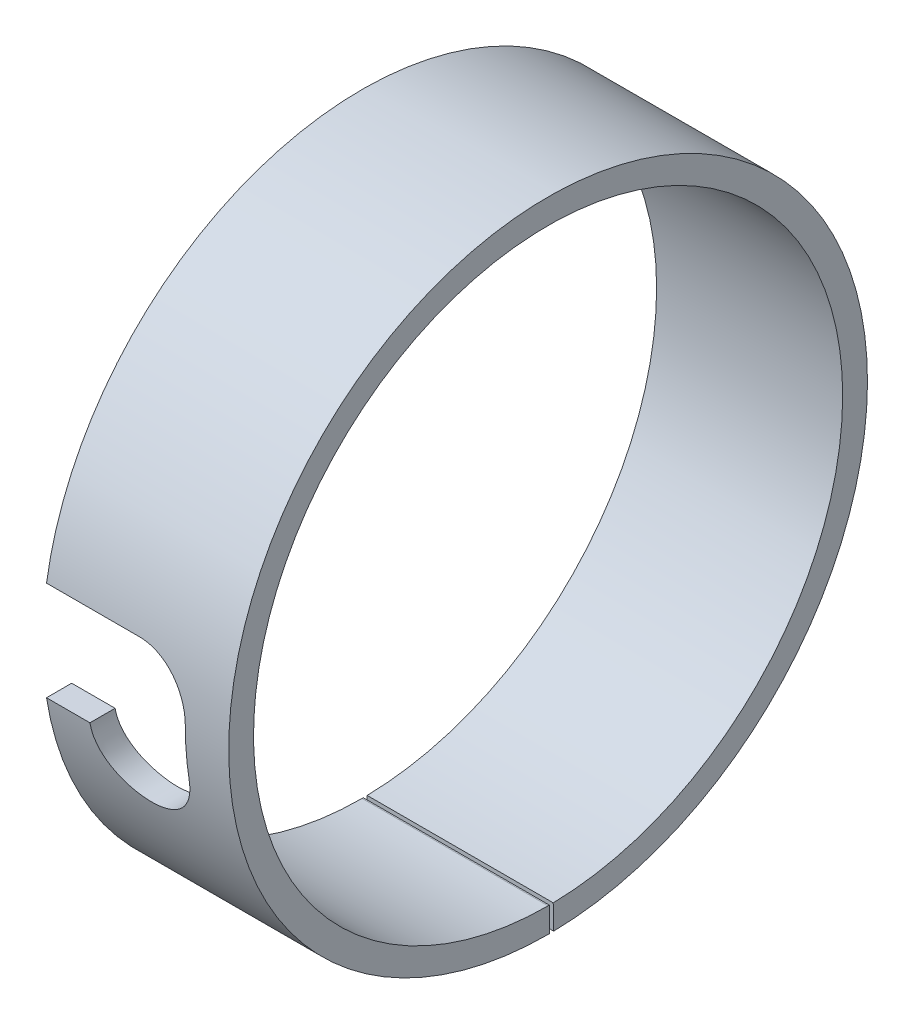
ISO-10303-21;
HEADER;
FILE_DESCRIPTION(('STEP AP214'),'2;1');
FILE_NAME('part.step','',(''),(''),'','','');
FILE_SCHEMA(('AUTOMOTIVE_DESIGN { 1 0 10303 214 1 1 1 1 }'));
ENDSEC;
DATA;
#1=APPLICATION_CONTEXT('core data for automotive mechanical design processes');
#2=APPLICATION_PROTOCOL_DEFINITION('international standard','automotive_design',2000,#1);
#3=PRODUCT_CONTEXT('',#1,'mechanical');
#4=PRODUCT('Part','Part','',(#3));
#5=PRODUCT_RELATED_PRODUCT_CATEGORY('part','',(#4));
#6=PRODUCT_DEFINITION_FORMATION('','',#4);
#7=PRODUCT_DEFINITION_CONTEXT('part definition',#1,'design');
#8=PRODUCT_DEFINITION('design','',#6,#7);
#9=PRODUCT_DEFINITION_SHAPE('','',#8);
#10=(LENGTH_UNIT() NAMED_UNIT(*) SI_UNIT(.MILLI.,.METRE.));
#11=(NAMED_UNIT(*) PLANE_ANGLE_UNIT() SI_UNIT($,.RADIAN.));
#12=(NAMED_UNIT(*) SI_UNIT($,.STERADIAN.) SOLID_ANGLE_UNIT());
#13=UNCERTAINTY_MEASURE_WITH_UNIT(LENGTH_MEASURE(1.E-05),#10,'distance_accuracy_value','');
#14=(GEOMETRIC_REPRESENTATION_CONTEXT(3) GLOBAL_UNCERTAINTY_ASSIGNED_CONTEXT((#13)) GLOBAL_UNIT_ASSIGNED_CONTEXT((#10,
#11,#12)) REPRESENTATION_CONTEXT('',''));
#15=CARTESIAN_POINT('',(0.,0.,0.));
#16=DIRECTION('',(0.,0.,1.));
#17=DIRECTION('',(1.,0.,0.));
#18=AXIS2_PLACEMENT_3D('',#15,#16,#17);
#19=CARTESIAN_POINT('',(338.,115.75,-118.100000000001));
#20=DIRECTION('',(1.,0.,0.));
#21=DIRECTION('',(0.,0.,1.));
#22=AXIS2_PLACEMENT_3D('',#19,#20,#21);
#23=PLANE('',#22);
#24=CARTESIAN_POINT('',(338.,139.5,-118.000000000001));
#25=DIRECTION('',(1.,0.,0.));
#26=DIRECTION('',(0.,0.,-1.));
#27=AXIS2_PLACEMENT_3D('',#24,#25,#26);
#28=CIRCLE('',#27,23.7500000000003);
#29=CARTESIAN_POINT('',(338.,143.5,-94.5892652827819));
#30=VERTEX_POINT('',#29);
#31=CARTESIAN_POINT('',(338.,115.753617240036,-118.414494652886));
#32=VERTEX_POINT('',#31);
#33=EDGE_CURVE('E248',#30,#32,#28,.F.);
#34=ORIENTED_EDGE('',*,*,#33,.F.);
#35=DIRECTION('',(0.,0.,1.));
#36=VECTOR('',#35,1.);
#37=CARTESIAN_POINT('',(338.,143.5,-92.5625767814434));
#38=LINE('',#37,#36);
#39=CARTESIAN_POINT('',(338.,143.5,-92.5625767814434));
#40=VERTEX_POINT('',#39);
#41=EDGE_CURVE('E276',#30,#40,#38,.T.);
#42=ORIENTED_EDGE('',*,*,#41,.T.);
#43=CARTESIAN_POINT('',(338.,139.5,-118.000000000001));
#44=DIRECTION('',(1.,0.,0.));
#45=DIRECTION('',(0.,0.,-1.));
#46=AXIS2_PLACEMENT_3D('',#43,#44,#45);
#47=CIRCLE('',#46,25.7500000000003);
#48=CARTESIAN_POINT('',(338.,113.753921849723,-118.449399465761));
#49=VERTEX_POINT('',#48);
#50=EDGE_CURVE('E267',#40,#49,#47,.F.);
#51=ORIENTED_EDGE('',*,*,#50,.T.);
#52=DIRECTION('',(0.,-0.999847695156391,-0.0174524064372694));
#53=VECTOR('',#52,1.);
#54=CARTESIAN_POINT('',(338.,115.753617240036,-118.414494652886));
#55=LINE('',#54,#53);
#56=EDGE_CURVE('E259',#32,#49,#55,.T.);
#57=ORIENTED_EDGE('',*,*,#56,.F.);
#58=EDGE_LOOP('',(#34,#42,#51,#57));
#59=FACE_BOUND('',#58,.T.);
#60=ADVANCED_FACE('F135',(#59),#23,.F.);
#61=CARTESIAN_POINT('',(353.,139.5,-118.000000000001));
#62=DIRECTION('',(1.,0.,0.));
#63=DIRECTION('',(0.,-0.999847695156391,-0.0174524064372693));
#64=AXIS2_PLACEMENT_3D('',#61,#62,#63);
#65=CYLINDRICAL_SURFACE('',#64,25.7500000000003);
#66=ORIENTED_EDGE('',*,*,#50,.F.);
#67=DIRECTION('',(1.,0.,0.));
#68=VECTOR('',#67,1.);
#69=CARTESIAN_POINT('',(353.,143.5,-92.5625767814435));
#70=LINE('',#69,#68);
#71=CARTESIAN_POINT('',(345.5,143.5,-92.5625767814434));
#72=VERTEX_POINT('',#71);
#73=EDGE_CURVE('E352',#40,#72,#70,.T.);
#74=ORIENTED_EDGE('',*,*,#73,.T.);
#75=CARTESIAN_POINT('',(349.5,139.5,-92.2500000000009));
#76=CARTESIAN_POINT('',(349.50000843318,139.612090964509,-92.2499929383089));
#77=CARTESIAN_POINT('',(349.495123614999,139.724159649726,-92.2507317666365));
#78=CARTESIAN_POINT('',(349.475816012682,139.947419112259,-92.2536472347804));
#79=CARTESIAN_POINT('',(349.461396355016,140.05861016526,-92.2558234032933));
#80=CARTESIAN_POINT('',(349.423267146034,140.279356384156,-92.2615596710617));
#81=CARTESIAN_POINT('',(349.399557522904,140.388911537399,-92.2651197810154));
#82=CARTESIAN_POINT('',(349.343163749521,140.605600937854,-92.2735168480953));
#83=CARTESIAN_POINT('',(349.310478932953,140.712735004686,-92.2783539000202));
#84=CARTESIAN_POINT('',(349.199437081499,141.029258864979,-92.2945876025436));
#85=CARTESIAN_POINT('',(349.108014875114,141.234213811648,-92.307719101874));
#86=CARTESIAN_POINT('',(348.946919286892,141.527852328029,-92.329782416334));
#87=CARTESIAN_POINT('',(348.889213135825,141.623450549481,-92.337532981689));
#88=CARTESIAN_POINT('',(348.766057912286,141.809522436376,-92.3536105653781));
#89=CARTESIAN_POINT('',(348.700608871648,141.899996122886,-92.3619375813422));
#90=CARTESIAN_POINT('',(348.561056708755,142.076691636837,-92.3790867956007));
#91=CARTESIAN_POINT('',(348.486816387624,142.162804450899,-92.3879152897462));
#92=CARTESIAN_POINT('',(348.331041746762,142.328152286018,-92.4056457193129));
#93=CARTESIAN_POINT('',(348.249507624872,142.407387493514,-92.4145476527362));
#94=CARTESIAN_POINT('',(348.079764543955,142.55845418226,-92.4321657167246));
#95=CARTESIAN_POINT('',(347.991552737686,142.630282474152,-92.4408817659789));
#96=CARTESIAN_POINT('',(347.809310770075,142.766142640191,-92.4578878597921));
#97=CARTESIAN_POINT('',(347.715280324091,142.83017413247,-92.4661778834739));
#98=CARTESIAN_POINT('',(347.430486876596,143.006982949165,-92.4896586150217));
#99=CARTESIAN_POINT('',(347.23247684361,143.108470615313,-92.5039463123691));
#100=CARTESIAN_POINT('',(346.822631507868,143.278037414842,-92.528519912969));
#101=CARTESIAN_POINT('',(346.610808224275,143.346145164577,-92.5388092424193));
#102=CARTESIAN_POINT('',(346.248248446264,143.430546639514,-92.5517287783254));
#103=CARTESIAN_POINT('',(346.09975036004,143.456457013478,-92.5557576317402));
#104=CARTESIAN_POINT('',(345.800870785894,143.491183439385,-92.5611900656631));
#105=CARTESIAN_POINT('',(345.650491183816,143.500015412753,-92.5625960912726));
#106=CARTESIAN_POINT('',(345.5,143.5,-92.5625767814434));
#107=B_SPLINE_CURVE_WITH_KNOTS('',3,(#75,#76,#77,#78,#79,#80,#81,#82,#83,#84,#85,#86,#87,#88,
#89,#90,#91,#92,#93,#94,#95,#96,#97,#98,#99,#100,#101,#102,#103,#104,#105,#106),.UNSPECIFIED.,
.F.,.F.,(4,2,2,2,2,2,2,2,2,2,2,2,2,2,2,4),(0.,0.336129086672246,0.672148011402556,
1.00816953373031,1.34421600892141,2.01497336537978,2.35048597866614,2.68599721260628,
3.02768841925539,3.36937036042151,3.71119881806484,4.05304401093263,4.71874825553939,
5.38388079421972,5.83532136930664,6.28634088332569),.UNSPECIFIED.);
#108=CARTESIAN_POINT('',(349.5,139.5,-92.2500000000009));
#109=VERTEX_POINT('',#108);
#110=EDGE_CURVE('E291',#109,#72,#107,.T.);
#111=ORIENTED_EDGE('',*,*,#110,.F.);
#112=CARTESIAN_POINT('',(349.5,139.5,-118.000000000001));
#113=DIRECTION('',(-1.,0.,0.));
#114=DIRECTION('',(0.,0.,1.));
#115=AXIS2_PLACEMENT_3D('',#112,#113,#114);
#116=CIRCLE('',#115,25.7500000000003);
#117=CARTESIAN_POINT('',(349.5,135.500000000002,-92.5625767814434));
#118=VERTEX_POINT('',#117);
#119=EDGE_CURVE('E330',#109,#118,#116,.F.);
#120=ORIENTED_EDGE('',*,*,#119,.T.);
#121=CARTESIAN_POINT('',(341.5,135.500000000002,-92.5625767814433));
#122=CARTESIAN_POINT('',(341.499989349324,135.385418830857,-92.5805867680038));
#123=CARTESIAN_POINT('',(341.505024544503,135.270981812715,-92.5993826966726));
#124=CARTESIAN_POINT('',(341.524937106057,135.043240495889,-92.6383550806432));
#125=CARTESIAN_POINT('',(341.539811260553,134.9299358398,-92.6585310835002));
#126=CARTESIAN_POINT('',(341.579156049342,134.705207770023,-92.7000879637713));
#127=CARTESIAN_POINT('',(341.603628397337,134.593784695987,-92.721469055763));
#128=CARTESIAN_POINT('',(341.66185808202,134.373606763667,-92.7651983885698));
#129=CARTESIAN_POINT('',(341.695616132293,134.264852111144,-92.7875467036025));
#130=CARTESIAN_POINT('',(341.810259286541,133.943940978857,-92.8556108894628));
#131=CARTESIAN_POINT('',(341.904596122855,133.736672993355,-92.9024327605243));
#132=CARTESIAN_POINT('',(342.126601441529,133.340989116697,-92.9965906103569));
#133=CARTESIAN_POINT('',(342.254253937869,133.15256424377,-93.0439263321522));
#134=CARTESIAN_POINT('',(342.433444868841,132.931474228191,-93.1018242911723));
#135=CARTESIAN_POINT('',(342.470878839218,132.887303813108,-93.1135223618175));
#136=CARTESIAN_POINT('',(342.547682027814,132.800623134722,-93.136716723612));
#137=CARTESIAN_POINT('',(342.587050911548,132.758112586745,-93.1482130491736));
#138=CARTESIAN_POINT('',(342.667688377252,132.674861960583,-93.170947380757));
#139=CARTESIAN_POINT('',(342.708956940758,132.634121865195,-93.1821853892881));
#140=CARTESIAN_POINT('',(342.793372514092,132.554545987144,-93.204337567565));
#141=CARTESIAN_POINT('',(342.836519616797,132.515710298839,-93.2152517212541));
#142=CARTESIAN_POINT('',(342.968619710511,132.402078346591,-93.2474605703877));
#143=CARTESIAN_POINT('',(343.060221290092,132.330167699868,-93.2682187708484));
#144=CARTESIAN_POINT('',(343.24957483431,132.194475808364,-93.3079605103145));
#145=CARTESIAN_POINT('',(343.347327461777,132.13069544194,-93.326943857514));
#146=CARTESIAN_POINT('',(343.640053846172,131.957147182171,-93.3792347147331));
#147=CARTESIAN_POINT('',(343.842310765132,131.85855469123,-93.40979721434));
#148=CARTESIAN_POINT('',(344.261204066725,131.695166419348,-93.4611638330028));
#149=CARTESIAN_POINT('',(344.477834868695,131.630357607442,-93.4819717142762));
#150=CARTESIAN_POINT('',(344.809424780097,131.560803199007,-93.5044454307098));
#151=CARTESIAN_POINT('',(344.921325050193,131.542217635298,-93.5104840365788));
#152=CARTESIAN_POINT('',(345.146457522848,131.514764473587,-93.5194212063009));
#153=CARTESIAN_POINT('',(345.259689530595,131.505895471636,-93.5223202237936));
#154=CARTESIAN_POINT('',(345.486466655973,131.498345983854,-93.5247870262985));
#155=CARTESIAN_POINT('',(345.600011552986,131.499659570521,-93.5243567493639));
#156=CARTESIAN_POINT('',(345.826462137857,131.512263160664,-93.5202412477809));
#157=CARTESIAN_POINT('',(345.939367780026,131.523553868391,-93.5165557933606));
#158=CARTESIAN_POINT('',(346.25742730072,131.569192472579,-93.5017173069437));
#159=CARTESIAN_POINT('',(346.460873364656,131.614921588264,-93.486898241681));
#160=CARTESIAN_POINT('',(346.857791068629,131.736389778658,-93.4481596512553));
#161=CARTESIAN_POINT('',(347.051254268972,131.812153790411,-93.4242325646425));
#162=CARTESIAN_POINT('',(347.336449728714,131.94931831106,-93.381873184642));
#163=CARTESIAN_POINT('',(347.433445412554,132.000865644047,-93.3661043033845));
#164=CARTESIAN_POINT('',(347.622748200917,132.111478569181,-93.3327019466033));
#165=CARTESIAN_POINT('',(347.715055161583,132.170544391813,-93.3150684139204));
#166=CARTESIAN_POINT('',(347.894254447308,132.295821715296,-93.2782165984358));
#167=CARTESIAN_POINT('',(347.981150026887,132.362028854444,-93.2589992846341));
#168=CARTESIAN_POINT('',(348.148941124212,132.501315555911,-93.2192381381545));
#169=CARTESIAN_POINT('',(348.229836991938,132.574394716801,-93.1986943829826));
#170=CARTESIAN_POINT('',(348.346997950375,132.689684103206,-93.1668823683509));
#171=CARTESIAN_POINT('',(348.385740043884,132.729510300882,-93.1559919470338));
#172=CARTESIAN_POINT('',(348.461505723274,132.81071083808,-93.1340055080686));
#173=CARTESIAN_POINT('',(348.498529275696,132.852085207716,-93.1229094864235));
#174=CARTESIAN_POINT('',(348.606923048394,132.978447852651,-93.089370832917));
#175=CARTESIAN_POINT('',(348.675624839602,133.065683998792,-93.0666753026408));
#176=CARTESIAN_POINT('',(348.805565788455,133.245591855704,-93.0209386636847));
#177=CARTESIAN_POINT('',(348.866796821901,133.338269324391,-92.9978972088593));
#178=CARTESIAN_POINT('',(348.9813640793,133.528374887103,-92.9518113103614));
#179=CARTESIAN_POINT('',(349.034700845997,133.625802653924,-92.9287668670036));
#180=CARTESIAN_POINT('',(349.134631626769,133.827772239156,-92.88228936556));
#181=CARTESIAN_POINT('',(349.180976043196,133.932439705858,-92.8588653203312));
#182=CARTESIAN_POINT('',(349.264614765792,134.145462848812,-92.8126359200713));
#183=CARTESIAN_POINT('',(349.301909143241,134.253818496007,-92.7898305601687));
#184=CARTESIAN_POINT('',(349.367085050059,134.473305477955,-92.7451516731826));
#185=CARTESIAN_POINT('',(349.394982297853,134.584431840315,-92.723276644056));
#186=CARTESIAN_POINT('',(349.441164994672,134.808830870327,-92.6806701634131));
#187=CARTESIAN_POINT('',(349.459455395372,134.922102401035,-92.6599381277036));
#188=CARTESIAN_POINT('',(349.481868290306,135.112971572838,-92.6263407310124));
#189=CARTESIAN_POINT('',(349.488663330698,135.190200584873,-92.6131082763543));
#190=CARTESIAN_POINT('',(349.497727184715,135.344931222599,-92.5873247328951));
#191=CARTESIAN_POINT('',(349.500001980708,135.422432351803,-92.5747727649388));
#192=CARTESIAN_POINT('',(349.5,135.500000000002,-92.5625767814434));
#193=B_SPLINE_CURVE_WITH_KNOTS('',3,(#121,#122,#123,#124,#125,#126,#127,#128,#129,#130,#131,
#132,#133,#134,#135,#136,#137,#138,#139,#140,#141,#142,#143,#144,#145,#146,#147,#148,#149,#150,
#151,#152,#153,#154,#155,#156,#157,#158,#159,#160,#161,#162,#163,#164,#165,#166,#167,#168,#169,
#170,#171,#172,#173,#174,#175,#176,#177,#178,#179,#180,#181,#182,#183,#184,#185,#186,#187,#188,
#189,#190,#191,#192),.UNSPECIFIED.,.F.,.F.,(4,2,2,2,2,2,2,2,2,2,2,2,2,2,2,2,2,2,2,2,2,2,2,2,2,2,
2,2,2,2,2,2,2,2,2,4),(0.,0.347820551141876,0.695527613982409,1.04329678616594,1.39109269107721,
2.08526370306509,2.77910223792432,2.95627981976707,3.13342688024223,3.31057221916131,
3.48772632637407,3.84207914527631,4.19647021442037,4.87440362516376,5.55207535109248,
5.89246840163617,6.23281226218603,6.57295801623801,6.91312778194602,7.53739035366799,
8.16217232047281,8.49476458243583,8.82736704269044,9.1597674973644,9.4921485468965,
9.66196109035049,9.8317769385229,10.1713724598702,10.5113340492656,10.8512722548767,
11.2013850753352,11.5514951381548,11.9010166353427,12.2503578007926,12.4861783899086,
12.7216866712415),.UNSPECIFIED.);
#194=CARTESIAN_POINT('',(341.5,135.500000000002,-92.5625767814433));
#195=VERTEX_POINT('',#194);
#196=EDGE_CURVE('E282',#195,#118,#193,.T.);
#197=ORIENTED_EDGE('',*,*,#196,.F.);
#198=DIRECTION('',(1.,0.,0.));
#199=VECTOR('',#198,1.);
#200=CARTESIAN_POINT('',(353.,135.500000000002,-92.5625767814434));
#201=LINE('',#200,#199);
#202=CARTESIAN_POINT('',(338.,135.500000000002,-92.5625767814433));
#203=VERTEX_POINT('',#202);
#204=EDGE_CURVE('E258',#203,#195,#201,.T.);
#205=ORIENTED_EDGE('',*,*,#204,.F.);
#206=CARTESIAN_POINT('',(338.,113.75,-118.000000000001));
#207=VERTEX_POINT('',#206);
#208=EDGE_CURVE('E182',#207,#203,#47,.F.);
#209=ORIENTED_EDGE('',*,*,#208,.F.);
#210=DIRECTION('',(1.,0.,0.));
#211=VECTOR('',#210,1.);
#212=CARTESIAN_POINT('',(0.,113.75,-118.000000000001));
#213=LINE('',#212,#211);
#214=CARTESIAN_POINT('',(353.,113.75,-118.000000000001));
#215=VERTEX_POINT('',#214);
#216=EDGE_CURVE('E218',#207,#215,#213,.T.);
#217=ORIENTED_EDGE('',*,*,#216,.T.);
#218=CARTESIAN_POINT('',(353.,139.5,-118.000000000001));
#219=DIRECTION('',(1.,0.,0.));
#220=DIRECTION('',(0.,0.,-1.));
#221=AXIS2_PLACEMENT_3D('',#218,#219,#220);
#222=CIRCLE('',#221,25.7500000000003);
#223=CARTESIAN_POINT('',(353.,113.753921849723,-118.449399465761));
#224=VERTEX_POINT('',#223);
#225=EDGE_CURVE('E251',#224,#215,#222,.T.);
#226=ORIENTED_EDGE('',*,*,#225,.F.);
#227=DIRECTION('',(1.,0.,0.));
#228=VECTOR('',#227,1.);
#229=CARTESIAN_POINT('',(353.,113.753921849723,-118.449399465761));
#230=LINE('',#229,#228);
#231=EDGE_CURVE('E247',#49,#224,#230,.T.);
#232=ORIENTED_EDGE('',*,*,#231,.F.);
#233=EDGE_LOOP('',(#66,#74,#111,#120,#197,#205,#209,#217,#226,#232));
#234=FACE_BOUND('',#233,.T.);
#235=ADVANCED_FACE('F266',(#234),#65,.T.);
#236=CARTESIAN_POINT('',(353.,139.5,-118.000000000001));
#237=DIRECTION('',(1.,0.,0.));
#238=DIRECTION('',(0.,-0.999847695156391,-0.0174524064372693));
#239=AXIS2_PLACEMENT_3D('',#236,#237,#238);
#240=CYLINDRICAL_SURFACE('',#239,23.7500000000003);
#241=DIRECTION('',(1.,0.,0.));
#242=VECTOR('',#241,1.);
#243=CARTESIAN_POINT('',(353.,143.5,-94.5892652827819));
#244=LINE('',#243,#242);
#245=CARTESIAN_POINT('',(345.5,143.5,-94.5892652827818));
#246=VERTEX_POINT('',#245);
#247=EDGE_CURVE('E364',#246,#30,#244,.F.);
#248=ORIENTED_EDGE('',*,*,#247,.T.);
#249=ORIENTED_EDGE('',*,*,#33,.T.);
#250=DIRECTION('',(1.,0.,0.));
#251=VECTOR('',#250,1.);
#252=CARTESIAN_POINT('',(353.,115.753617240036,-118.414494652886));
#253=LINE('',#252,#251);
#254=CARTESIAN_POINT('',(353.,115.753617240036,-118.414494652886));
#255=VERTEX_POINT('',#254);
#256=EDGE_CURVE('E256',#32,#255,#253,.T.);
#257=ORIENTED_EDGE('',*,*,#256,.T.);
#258=CARTESIAN_POINT('',(353.,139.5,-118.000000000001));
#259=DIRECTION('',(1.,0.,0.));
#260=DIRECTION('',(0.,0.,-1.));
#261=AXIS2_PLACEMENT_3D('',#258,#259,#260);
#262=CIRCLE('',#261,23.7500000000003);
#263=CARTESIAN_POINT('',(353.,115.75,-118.000000000001));
#264=VERTEX_POINT('',#263);
#265=EDGE_CURVE('E159',#255,#264,#262,.T.);
#266=ORIENTED_EDGE('',*,*,#265,.T.);
#267=DIRECTION('',(1.,0.,0.));
#268=VECTOR('',#267,1.);
#269=CARTESIAN_POINT('',(353.,115.75,-118.000000000001));
#270=LINE('',#269,#268);
#271=CARTESIAN_POINT('',(338.,115.75,-118.000000000001));
#272=VERTEX_POINT('',#271);
#273=EDGE_CURVE('E211',#272,#264,#270,.T.);
#274=ORIENTED_EDGE('',*,*,#273,.F.);
#275=CARTESIAN_POINT('',(338.,135.500000000002,-94.5892652827817));
#276=VERTEX_POINT('',#275);
#277=EDGE_CURVE('E242',#272,#276,#28,.F.);
#278=ORIENTED_EDGE('',*,*,#277,.T.);
#279=DIRECTION('',(1.,0.,0.));
#280=VECTOR('',#279,1.);
#281=CARTESIAN_POINT('',(353.,135.500000000002,-94.5892652827817));
#282=LINE('',#281,#280);
#283=CARTESIAN_POINT('',(341.5,135.500000000002,-94.5892652827817));
#284=VERTEX_POINT('',#283);
#285=EDGE_CURVE('E326',#284,#276,#282,.F.);
#286=ORIENTED_EDGE('',*,*,#285,.F.);
#287=CARTESIAN_POINT('',(349.5,135.500000000002,-94.5892652827817));
#288=CARTESIAN_POINT('',(349.500013336012,135.385187098226,-94.6088737117858));
#289=CARTESIAN_POINT('',(349.495021246226,135.270533641799,-94.6293412538894));
#290=CARTESIAN_POINT('',(349.475227050707,135.042388441157,-94.6717864115223));
#291=CARTESIAN_POINT('',(349.46042755002,134.928896396575,-94.6937636246635));
#292=CARTESIAN_POINT('',(349.421226987398,134.703899911419,-94.7390215673879));
#293=CARTESIAN_POINT('',(349.396829759356,134.592394695758,-94.7623017732987));
#294=CARTESIAN_POINT('',(349.338700279596,134.372072474041,-94.8099254951435));
#295=CARTESIAN_POINT('',(349.304967488674,134.263255623655,-94.8342690724276));
#296=CARTESIAN_POINT('',(349.228494878537,134.049117739778,-94.8837189047676));
#297=CARTESIAN_POINT('',(349.185762245902,133.943793994173,-94.9088245376957));
#298=CARTESIAN_POINT('',(349.09159257738,133.737230128266,-94.9595075422812));
#299=CARTESIAN_POINT('',(349.040155540667,133.635990008352,-94.9850849139835));
#300=CARTESIAN_POINT('',(348.928917565941,133.438254413589,-95.0363727657973));
#301=CARTESIAN_POINT('',(348.869116658375,133.341758921471,-95.0620832454239));
#302=CARTESIAN_POINT('',(348.741524762248,133.154180841795,-95.1132675185943));
#303=CARTESIAN_POINT('',(348.673737318452,133.063095879614,-95.1387414117694));
#304=CARTESIAN_POINT('',(348.56567594149,132.930155330795,-95.1767262603417));
#305=CARTESIAN_POINT('',(348.528207516924,132.886058540704,-95.1894692688494));
#306=CARTESIAN_POINT('',(348.451356925623,132.799510720241,-95.2147421745726));
#307=CARTESIAN_POINT('',(348.411975082113,132.75705941407,-95.2272721073024));
#308=CARTESIAN_POINT('',(348.331336423281,132.673893041476,-95.2520628191266));
#309=CARTESIAN_POINT('',(348.290079629034,132.633177955548,-95.2643236012438));
#310=CARTESIAN_POINT('',(348.205697098185,132.553628463976,-95.2885017548632));
#311=CARTESIAN_POINT('',(348.162571278648,132.51479414195,-95.3004191110874));
#312=CARTESIAN_POINT('',(348.030543153292,132.401146663908,-95.3355990576744));
#313=CARTESIAN_POINT('',(347.938992022601,132.329190893063,-95.3582889576059));
#314=CARTESIAN_POINT('',(347.749685151136,132.193382125461,-95.401749636561));
#315=CARTESIAN_POINT('',(347.651928841288,132.12952987349,-95.4225202391361));
#316=CARTESIAN_POINT('',(347.357709389097,131.954987873959,-95.4800096269378));
#317=CARTESIAN_POINT('',(347.153700771107,131.855707312386,-95.5136770128143));
#318=CARTESIAN_POINT('',(346.730809014985,131.691679827443,-95.5701036925072));
#319=CARTESIAN_POINT('',(346.51193125982,131.626920480928,-95.5928669101059));
#320=CARTESIAN_POINT('',(346.178862698238,131.558426253055,-95.6170953713338));
#321=CARTESIAN_POINT('',(346.067812315799,131.540396496515,-95.6235081162803));
#322=CARTESIAN_POINT('',(345.844395606292,131.513888422641,-95.6329541317375));
#323=CARTESIAN_POINT('',(345.732029468062,131.505408751242,-95.6359878813413));
#324=CARTESIAN_POINT('',(345.563293521353,131.500116399833,-95.6378811540909));
#325=CARTESIAN_POINT('',(345.507029073427,131.499589464649,-95.6380695954248));
#326=CARTESIAN_POINT('',(345.394536856665,131.50104560618,-95.6375486663624));
#327=CARTESIAN_POINT('',(345.33830908748,131.503028658615,-95.6368393046511));
#328=CARTESIAN_POINT('',(345.169868055424,131.512674252789,-95.6333913262445));
#329=CARTESIAN_POINT('',(345.057870909902,131.524032436927,-95.6293330993708));
#330=CARTESIAN_POINT('',(344.844649794302,131.554870592499,-95.6183633395152));
#331=CARTESIAN_POINT('',(344.743301110352,131.573600891951,-95.611715642505));
#332=CARTESIAN_POINT('',(344.542546421449,131.618677091193,-95.5958081517458));
#333=CARTESIAN_POINT('',(344.443140281893,131.6450224613,-95.586548539675));
#334=CARTESIAN_POINT('',(344.148511962105,131.735053574353,-95.5551294976757));
#335=CARTESIAN_POINT('',(343.956934342886,131.809726199876,-95.5293328344496));
#336=CARTESIAN_POINT('',(343.574933829989,131.992182668008,-95.4676887859987));
#337=CARTESIAN_POINT('',(343.385535712737,132.101922615786,-95.4312630558911));
#338=CARTESIAN_POINT('',(343.117532796041,132.287594310846,-95.3715242015742));
#339=CARTESIAN_POINT('',(343.030879583317,132.352996411487,-95.3507608262126));
#340=CARTESIAN_POINT('',(342.863485942386,132.490604096778,-95.3077972752875));
#341=CARTESIAN_POINT('',(342.782744950755,132.562809031628,-95.2855972370162));
#342=CARTESIAN_POINT('',(342.665570462196,132.677011813478,-95.2511325418437));
#343=CARTESIAN_POINT('',(342.626672198329,132.716638155918,-95.2392821602943));
#344=CARTESIAN_POINT('',(342.550619416586,132.797463778531,-95.215349761639));
#345=CARTESIAN_POINT('',(342.513464923117,132.838663080705,-95.2032677412943));
#346=CARTESIAN_POINT('',(342.404691032606,132.964517254633,-95.1667437343699));
#347=CARTESIAN_POINT('',(342.335755480793,133.051434008447,-95.1420221000264));
#348=CARTESIAN_POINT('',(342.205309738677,133.230744177193,-95.0921936470248));
#349=CARTESIAN_POINT('',(342.143809490888,133.323144684306,-95.0670863621187));
#350=CARTESIAN_POINT('',(342.028653825779,133.512656170822,-95.0168787572585));
#351=CARTESIAN_POINT('',(341.974997834013,133.609766804602,-94.9917784369288));
#352=CARTESIAN_POINT('',(341.823181850487,133.913453835005,-94.9154345337302));
#353=CARTESIAN_POINT('',(341.738108318421,134.126988259834,-94.8646711909901));
#354=CARTESIAN_POINT('',(341.638533802495,134.455821586441,-94.7915642017045));
#355=CARTESIAN_POINT('',(341.610022166674,134.566797199155,-94.7677126771547));
#356=CARTESIAN_POINT('',(341.562562854175,134.791021457289,-94.7212312287169));
#357=CARTESIAN_POINT('',(341.54361023402,134.904268896252,-94.6986006788169));
#358=CARTESIAN_POINT('',(341.519770175451,135.098048687134,-94.6613638077947));
#359=CARTESIAN_POINT('',(341.512369553255,135.178211580719,-94.6463856617585));
#360=CARTESIAN_POINT('',(341.502486655774,135.338887713435,-94.6172217133803));
#361=CARTESIAN_POINT('',(341.49999876369,135.419400446868,-94.6030350242155));
#362=CARTESIAN_POINT('',(341.5,135.500000000002,-94.5892652827817));
#363=B_SPLINE_CURVE_WITH_KNOTS('',3,(#287,#288,#289,#290,#291,#292,#293,#294,#295,#296,#297,
#298,#299,#300,#301,#302,#303,#304,#305,#306,#307,#308,#309,#310,#311,#312,#313,#314,#315,#316,
#317,#318,#319,#320,#321,#322,#323,#324,#325,#326,#327,#328,#329,#330,#331,#332,#333,#334,#335,
#336,#337,#338,#339,#340,#341,#342,#343,#344,#345,#346,#347,#348,#349,#350,#351,#352,#353,#354,
#355,#356,#357,#358,#359,#360,#361,#362),.UNSPECIFIED.,.F.,.F.,(4,2,2,2,2,2,2,2,2,2,2,2,2,2,2,2,
2,2,2,2,2,2,2,2,2,2,2,2,2,2,2,2,2,2,2,2,2,4),(0.,0.349297309506514,0.698501875808643,
1.04756709084596,1.39665247149052,1.74546014925733,2.09426786012987,2.44307430127162,
2.79172650638472,2.96943738124797,3.14711833994124,3.32479730202566,3.50248415635322,
3.85786595047493,4.2132803837743,4.89795252011503,5.58237809696232,5.92006627639752,
6.25770657039145,6.42645492566148,6.59520164854542,6.93261689108039,7.24211715543251,
7.55159589703966,8.17071694232995,8.83329173246909,9.16458994842199,9.49585655105535,
9.66614720577326,9.83644024322732,10.1770017622111,10.5180137590814,10.8590007706164,
11.561300169125,11.9121002900441,12.2627188070311,12.5082342786027,12.7534688856803),.UNSPECIFIED.);
#364=CARTESIAN_POINT('',(349.5,135.500000000002,-94.5892652827817));
#365=VERTEX_POINT('',#364);
#366=EDGE_CURVE('E373',#365,#284,#363,.T.);
#367=ORIENTED_EDGE('',*,*,#366,.F.);
#368=CARTESIAN_POINT('',(349.5,139.5,-118.000000000001));
#369=DIRECTION('',(1.,0.,0.));
#370=DIRECTION('',(0.,0.,-1.));
#371=AXIS2_PLACEMENT_3D('',#368,#369,#370);
#372=CIRCLE('',#371,23.7500000000003);
#373=CARTESIAN_POINT('',(349.5,139.5,-94.2500000000009));
#374=VERTEX_POINT('',#373);
#375=EDGE_CURVE('E367',#365,#374,#372,.F.);
#376=ORIENTED_EDGE('',*,*,#375,.T.);
#377=CARTESIAN_POINT('',(345.5,143.5,-94.5892652827818));
#378=CARTESIAN_POINT('',(345.611985379615,143.500008003411,-94.5892728251598));
#379=CARTESIAN_POINT('',(345.7239464207,143.495117936625,-94.588431216665));
#380=CARTESIAN_POINT('',(345.946981608024,143.475805679652,-94.5851405973787));
#381=CARTESIAN_POINT('',(346.058056060766,143.461386942125,-94.5826921688118));
#382=CARTESIAN_POINT('',(346.278556765236,143.423281913114,-94.5762788390222));
#383=CARTESIAN_POINT('',(346.387983096736,143.399596071688,-94.5723140114435));
#384=CARTESIAN_POINT('',(346.604415047056,143.3432815247,-94.563010095865));
#385=CARTESIAN_POINT('',(346.711420462081,143.310652069266,-94.5576708926338));
#386=CARTESIAN_POINT('',(347.027531128389,143.199846941738,-94.53983582018));
#387=CARTESIAN_POINT('',(347.232211087875,143.10867016363,-94.5255074106089));
#388=CARTESIAN_POINT('',(347.525505215525,142.948051137797,-94.5015674453699));
#389=CARTESIAN_POINT('',(347.621001435022,142.89052081282,-94.4931774881496));
#390=CARTESIAN_POINT('',(347.806891332779,142.767745608159,-94.4757956437307));
#391=CARTESIAN_POINT('',(347.897285063982,142.702500808541,-94.4668037627797));
#392=CARTESIAN_POINT('',(348.074073082919,142.56319485393,-94.4482617045184));
#393=CARTESIAN_POINT('',(348.160342988513,142.488976915833,-94.4387037561703));
#394=CARTESIAN_POINT('',(348.325983759805,142.333216500136,-94.4194670063439));
#395=CARTESIAN_POINT('',(348.405354722975,142.251674126052,-94.4097882065753));
#396=CARTESIAN_POINT('',(348.556702968155,142.08191362132,-94.3906054207608));
#397=CARTESIAN_POINT('',(348.628677160543,141.993692727566,-94.3811015091154));
#398=CARTESIAN_POINT('',(348.764823312004,141.811409550016,-94.3625656654712));
#399=CARTESIAN_POINT('',(348.828994954848,141.717347029698,-94.3535337526104));
#400=CARTESIAN_POINT('',(349.00614914843,141.432491030431,-94.3280010665399));
#401=CARTESIAN_POINT('',(349.107836390136,141.234415342524,-94.3125231460483));
#402=CARTESIAN_POINT('',(349.277715445479,140.824334839372,-94.2860628733354));
#403=CARTESIAN_POINT('',(349.345936286437,140.612342276652,-94.2750766266116));
#404=CARTESIAN_POINT('',(349.430471711271,140.24938236559,-94.2613710333569));
#405=CARTESIAN_POINT('',(349.456418063388,140.100664329811,-94.2571301350214));
#406=CARTESIAN_POINT('',(349.491183459752,139.801332171107,-94.2514348281571));
#407=CARTESIAN_POINT('',(349.500018015324,139.650719890048,-94.2499778960636));
#408=CARTESIAN_POINT('',(349.5,139.5,-94.2500000000009));
#409=B_SPLINE_CURVE_WITH_KNOTS('',3,(#377,#378,#379,#380,#381,#382,#383,#384,#385,#386,#387,
#388,#389,#390,#391,#392,#393,#394,#395,#396,#397,#398,#399,#400,#401,#402,#403,#404,#405,#406,
#407,#408),.UNSPECIFIED.,.F.,.F.,(4,2,2,2,2,2,2,2,2,2,2,2,2,2,2,4),(0.,0.335808300043282,
0.671494988485345,1.00716537633513,1.3428639168838,2.01281432381081,2.34793434579171,
2.68305088993466,3.02522765432982,3.36739958351741,3.70971386155916,4.05204200864136,
4.71841145026414,5.38420188515911,5.83632254806934,6.28803318519796),.UNSPECIFIED.);
#410=EDGE_CURVE('E150',#246,#374,#409,.T.);
#411=ORIENTED_EDGE('',*,*,#410,.F.);
#412=EDGE_LOOP('',(#248,#249,#257,#266,#274,#278,#286,#367,#376,#411));
#413=FACE_BOUND('',#412,.T.);
#414=ADVANCED_FACE('F370',(#413),#240,.F.);
#415=DIRECTION('',(0.,0.,1.));
#416=VECTOR('',#415,1.);
#417=CARTESIAN_POINT('',(338.,135.500000000002,-92.5625767814433));
#418=LINE('',#417,#416);
#419=EDGE_CURVE('E245',#276,#203,#418,.T.);
#420=ORIENTED_EDGE('',*,*,#419,.F.);
#421=ORIENTED_EDGE('',*,*,#277,.F.);
#422=DIRECTION('',(0.,0.,1.));
#423=VECTOR('',#422,1.);
#424=CARTESIAN_POINT('',(338.,115.75,-118.100000000001));
#425=LINE('',#424,#423);
#426=CARTESIAN_POINT('',(338.,115.75,-118.100000000001));
#427=VERTEX_POINT('',#426);
#428=EDGE_CURVE('E220',#427,#272,#425,.T.);
#429=ORIENTED_EDGE('',*,*,#428,.F.);
#430=DIRECTION('',(0.,1.,0.));
#431=VECTOR('',#430,1.);
#432=CARTESIAN_POINT('',(338.,115.75,-118.100000000001));
#433=LINE('',#432,#431);
#434=CARTESIAN_POINT('',(338.,113.75,-118.100000000001));
#435=VERTEX_POINT('',#434);
#436=EDGE_CURVE('E14',#435,#427,#433,.T.);
#437=ORIENTED_EDGE('',*,*,#436,.F.);
#438=DIRECTION('',(0.,0.,-1.));
#439=VECTOR('',#438,1.);
#440=CARTESIAN_POINT('',(338.,113.75,0.));
#441=LINE('',#440,#439);
#442=EDGE_CURVE('E230',#435,#207,#441,.F.);
#443=ORIENTED_EDGE('',*,*,#442,.T.);
#444=ORIENTED_EDGE('',*,*,#208,.T.);
#445=EDGE_LOOP('',(#420,#421,#429,#437,#443,#444));
#446=FACE_BOUND('',#445,.T.);
#447=ADVANCED_FACE('F238',(#446),#23,.F.);
#448=CARTESIAN_POINT('',(353.,115.75,-118.100000000001));
#449=DIRECTION('',(-1.,0.,0.));
#450=DIRECTION('',(0.,0.,-1.));
#451=AXIS2_PLACEMENT_3D('',#448,#449,#450);
#452=PLANE('',#451);
#453=DIRECTION('',(0.,0.,-1.));
#454=VECTOR('',#453,1.);
#455=CARTESIAN_POINT('',(353.,115.75,-118.100000000001));
#456=LINE('',#455,#454);
#457=CARTESIAN_POINT('',(353.,115.75,-118.100000000001));
#458=VERTEX_POINT('',#457);
#459=EDGE_CURVE('E206',#264,#458,#456,.T.);
#460=ORIENTED_EDGE('',*,*,#459,.F.);
#461=ORIENTED_EDGE('',*,*,#265,.F.);
#462=DIRECTION('',(0.,-0.999847695156391,-0.0174524064372693));
#463=VECTOR('',#462,1.);
#464=CARTESIAN_POINT('',(353.,115.753617240036,-118.414494652886));
#465=LINE('',#464,#463);
#466=EDGE_CURVE('E228',#255,#224,#465,.T.);
#467=ORIENTED_EDGE('',*,*,#466,.T.);
#468=ORIENTED_EDGE('',*,*,#225,.T.);
#469=DIRECTION('',(0.,0.,-1.));
#470=VECTOR('',#469,1.);
#471=CARTESIAN_POINT('',(353.,113.75,0.));
#472=LINE('',#471,#470);
#473=CARTESIAN_POINT('',(353.,113.75,-118.100000000001));
#474=VERTEX_POINT('',#473);
#475=EDGE_CURVE('E210',#215,#474,#472,.T.);
#476=ORIENTED_EDGE('',*,*,#475,.T.);
#477=DIRECTION('',(0.,1.,0.));
#478=VECTOR('',#477,1.);
#479=CARTESIAN_POINT('',(353.,115.75,-118.100000000001));
#480=LINE('',#479,#478);
#481=EDGE_CURVE('E139',#474,#458,#480,.T.);
#482=ORIENTED_EDGE('',*,*,#481,.T.);
#483=EDGE_LOOP('',(#460,#461,#467,#468,#476,#482));
#484=FACE_BOUND('',#483,.T.);
#485=ADVANCED_FACE('F205',(#484),#452,.F.);
#486=CARTESIAN_POINT('',(353.,115.75,-118.100000000001));
#487=DIRECTION('',(0.,0.,1.));
#488=DIRECTION('',(-1.,0.,0.));
#489=AXIS2_PLACEMENT_3D('',#486,#487,#488);
#490=PLANE('',#489);
#491=DIRECTION('',(1.,0.,0.));
#492=VECTOR('',#491,1.);
#493=CARTESIAN_POINT('',(0.,113.75,-118.100000000001));
#494=LINE('',#493,#492);
#495=EDGE_CURVE('E227',#474,#435,#494,.F.);
#496=ORIENTED_EDGE('',*,*,#495,.T.);
#497=ORIENTED_EDGE('',*,*,#436,.T.);
#498=DIRECTION('',(-1.,0.,0.));
#499=VECTOR('',#498,1.);
#500=CARTESIAN_POINT('',(353.,115.75,-118.100000000001));
#501=LINE('',#500,#499);
#502=EDGE_CURVE('E216',#458,#427,#501,.T.);
#503=ORIENTED_EDGE('',*,*,#502,.F.);
#504=ORIENTED_EDGE('',*,*,#481,.F.);
#505=EDGE_LOOP('',(#496,#497,#503,#504));
#506=FACE_BOUND('',#505,.T.);
#507=ADVANCED_FACE('F137',(#506),#490,.F.);
#508=CARTESIAN_POINT('',(0.,115.75,0.));
#509=DIRECTION('',(0.,-1.,0.));
#510=DIRECTION('',(0.,0.,-1.));
#511=AXIS2_PLACEMENT_3D('',#508,#509,#510);
#512=PLANE('',#511);
#513=ORIENTED_EDGE('',*,*,#459,.T.);
#514=ORIENTED_EDGE('',*,*,#502,.T.);
#515=ORIENTED_EDGE('',*,*,#428,.T.);
#516=ORIENTED_EDGE('',*,*,#273,.T.);
#517=EDGE_LOOP('',(#513,#514,#515,#516));
#518=FACE_BOUND('',#517,.T.);
#519=ADVANCED_FACE('F214',(#518),#512,.F.);
#520=CARTESIAN_POINT('',(0.,113.75,0.));
#521=DIRECTION('',(0.,-1.,0.));
#522=DIRECTION('',(0.,0.,-1.));
#523=AXIS2_PLACEMENT_3D('',#520,#521,#522);
#524=PLANE('',#523);
#525=ORIENTED_EDGE('',*,*,#475,.F.);
#526=ORIENTED_EDGE('',*,*,#216,.F.);
#527=ORIENTED_EDGE('',*,*,#442,.F.);
#528=ORIENTED_EDGE('',*,*,#495,.F.);
#529=EDGE_LOOP('',(#525,#526,#527,#528));
#530=FACE_BOUND('',#529,.T.);
#531=ADVANCED_FACE('F234',(#530),#524,.T.);
#532=CARTESIAN_POINT('',(345.5,115.753617240036,-118.414494652886));
#533=DIRECTION('',(0.,0.0174524064372693,-0.999847695156391));
#534=DIRECTION('',(1.,0.,0.));
#535=AXIS2_PLACEMENT_3D('',#532,#533,#534);
#536=PLANE('',#535);
#537=ORIENTED_EDGE('',*,*,#466,.F.);
#538=ORIENTED_EDGE('',*,*,#256,.F.);
#539=ORIENTED_EDGE('',*,*,#56,.T.);
#540=ORIENTED_EDGE('',*,*,#231,.T.);
#541=EDGE_LOOP('',(#537,#538,#539,#540));
#542=FACE_BOUND('',#541,.T.);
#543=ADVANCED_FACE('F268',(#542),#536,.F.);
#544=CARTESIAN_POINT('',(353.,135.500000000002,-92.5625767814434));
#545=DIRECTION('',(0.,-1.,0.));
#546=DIRECTION('',(0.,0.,-1.));
#547=AXIS2_PLACEMENT_3D('',#544,#545,#546);
#548=PLANE('',#547);
#549=ORIENTED_EDGE('',*,*,#204,.T.);
#550=DIRECTION('',(0.,0.,1.));
#551=VECTOR('',#550,1.);
#552=CARTESIAN_POINT('',(341.5,135.500000000002,-92.5625767814433));
#553=LINE('',#552,#551);
#554=EDGE_CURVE('E325',#284,#195,#553,.T.);
#555=ORIENTED_EDGE('',*,*,#554,.F.);
#556=ORIENTED_EDGE('',*,*,#285,.T.);
#557=ORIENTED_EDGE('',*,*,#419,.T.);
#558=EDGE_LOOP('',(#549,#555,#556,#557));
#559=FACE_BOUND('',#558,.T.);
#560=ADVANCED_FACE('F308',(#559),#548,.F.);
#561=CARTESIAN_POINT('',(341.5,135.500000000002,-92.5625767814433));
#562=CARTESIAN_POINT('',(341.5,134.442067417262,-92.7289352327141));
#563=CARTESIAN_POINT('',(341.928344965277,133.421168015807,-92.9661221031548));
#564=CARTESIAN_POINT('',(343.39052734237,131.946355784231,-93.3709582015909));
#565=CARTESIAN_POINT('',(344.4391295983,131.501265686969,-93.5238329970846));
#566=CARTESIAN_POINT('',(346.551304326577,131.498740032398,-93.5246585172768));
#567=CARTESIAN_POINT('',(347.599596680614,131.937537535278,-93.3734490358121));
#568=CARTESIAN_POINT('',(349.077212696076,133.425633985809,-92.9648261750052));
#569=CARTESIAN_POINT('',(349.5,134.442028540642,-92.7289413460093));
#570=CARTESIAN_POINT('',(349.5,135.500000000002,-92.5625767814434));
#571=B_SPLINE_CURVE_WITH_KNOTS('',3,(#561,#562,#563,#564,#565,#566,#567,#568,#569,#570),
.UNSPECIFIED.,.F.,.F.,(4,2,2,2,4),(0.,0.25,0.5,0.75,1.),.UNSPECIFIED.);
#572=DIRECTION('',(0.,0.,1.));
#573=VECTOR('',#572,1.);
#574=SURFACE_OF_LINEAR_EXTRUSION('',#571,#573);
#575=ORIENTED_EDGE('',*,*,#196,.T.);
#576=DIRECTION('',(0.,0.,1.));
#577=VECTOR('',#576,1.);
#578=CARTESIAN_POINT('',(349.5,135.500000000002,-92.5625767814434));
#579=LINE('',#578,#577);
#580=EDGE_CURVE('E340',#365,#118,#579,.T.);
#581=ORIENTED_EDGE('',*,*,#580,.F.);
#582=ORIENTED_EDGE('',*,*,#366,.T.);
#583=ORIENTED_EDGE('',*,*,#554,.T.);
#584=EDGE_LOOP('',(#575,#581,#582,#583));
#585=FACE_BOUND('',#584,.T.);
#586=ADVANCED_FACE('F301',(#585),#574,.F.);
#587=CARTESIAN_POINT('',(349.5,139.5,-92.2500000000009));
#588=CARTESIAN_POINT('',(349.5,140.558159013928,-92.2500000000009));
#589=CARTESIAN_POINT('',(349.065453827687,141.590936475991,-92.3243366916317));
#590=CARTESIAN_POINT('',(347.593181103627,143.064136530974,-92.4870889065966));
#591=CARTESIAN_POINT('',(346.558144763998,143.5,-92.5625767814435));
#592=CARTESIAN_POINT('',(345.5,143.5,-92.5625767814434));
#593=B_SPLINE_CURVE_WITH_KNOTS('',3,(#587,#588,#589,#590,#591,#592),.UNSPECIFIED.,.F.,.F.,(4,2,
4),(0.,0.5,1.),.UNSPECIFIED.);
#594=DIRECTION('',(0.,0.,1.));
#595=VECTOR('',#594,1.);
#596=SURFACE_OF_LINEAR_EXTRUSION('',#593,#595);
#597=ORIENTED_EDGE('',*,*,#110,.T.);
#598=DIRECTION('',(0.,0.,1.));
#599=VECTOR('',#598,1.);
#600=CARTESIAN_POINT('',(345.5,143.5,-92.5625767814434));
#601=LINE('',#600,#599);
#602=EDGE_CURVE('E331',#246,#72,#601,.T.);
#603=ORIENTED_EDGE('',*,*,#602,.F.);
#604=ORIENTED_EDGE('',*,*,#410,.T.);
#605=DIRECTION('',(0.,0.,1.));
#606=VECTOR('',#605,1.);
#607=CARTESIAN_POINT('',(349.5,139.5,-92.2500000000009));
#608=LINE('',#607,#606);
#609=EDGE_CURVE('E336',#374,#109,#608,.T.);
#610=ORIENTED_EDGE('',*,*,#609,.T.);
#611=EDGE_LOOP('',(#597,#603,#604,#610));
#612=FACE_BOUND('',#611,.T.);
#613=ADVANCED_FACE('F307',(#612),#596,.F.);
#614=CARTESIAN_POINT('',(353.,143.5,-92.5625767814435));
#615=DIRECTION('',(0.,-1.,0.));
#616=DIRECTION('',(0.,0.,-1.));
#617=AXIS2_PLACEMENT_3D('',#614,#615,#616);
#618=PLANE('',#617);
#619=ORIENTED_EDGE('',*,*,#41,.F.);
#620=ORIENTED_EDGE('',*,*,#247,.F.);
#621=ORIENTED_EDGE('',*,*,#602,.T.);
#622=ORIENTED_EDGE('',*,*,#73,.F.);
#623=EDGE_LOOP('',(#619,#620,#621,#622));
#624=FACE_BOUND('',#623,.T.);
#625=ADVANCED_FACE('F362',(#624),#618,.T.);
#626=CARTESIAN_POINT('',(349.5,135.500000000002,-92.5625767814434));
#627=DIRECTION('',(-1.,0.,0.));
#628=DIRECTION('',(0.,0.,1.));
#629=AXIS2_PLACEMENT_3D('',#626,#627,#628);
#630=PLANE('',#629);
#631=ORIENTED_EDGE('',*,*,#609,.F.);
#632=ORIENTED_EDGE('',*,*,#375,.F.);
#633=ORIENTED_EDGE('',*,*,#580,.T.);
#634=ORIENTED_EDGE('',*,*,#119,.F.);
#635=EDGE_LOOP('',(#631,#632,#633,#634));
#636=FACE_BOUND('',#635,.T.);
#637=ADVANCED_FACE('F311',(#636),#630,.T.);
#638=CLOSED_SHELL('',(#60,#235,#414,#447,#485,#507,#519,#531,#543,#560,#586,#613,#625,#637));
#639=MANIFOLD_SOLID_BREP('B2',#638);
#640=ADVANCED_BREP_SHAPE_REPRESENTATION('',(#18,#639),#14);
#641=SHAPE_DEFINITION_REPRESENTATION(#9,#640);
ENDSEC;
END-ISO-10303-21;
